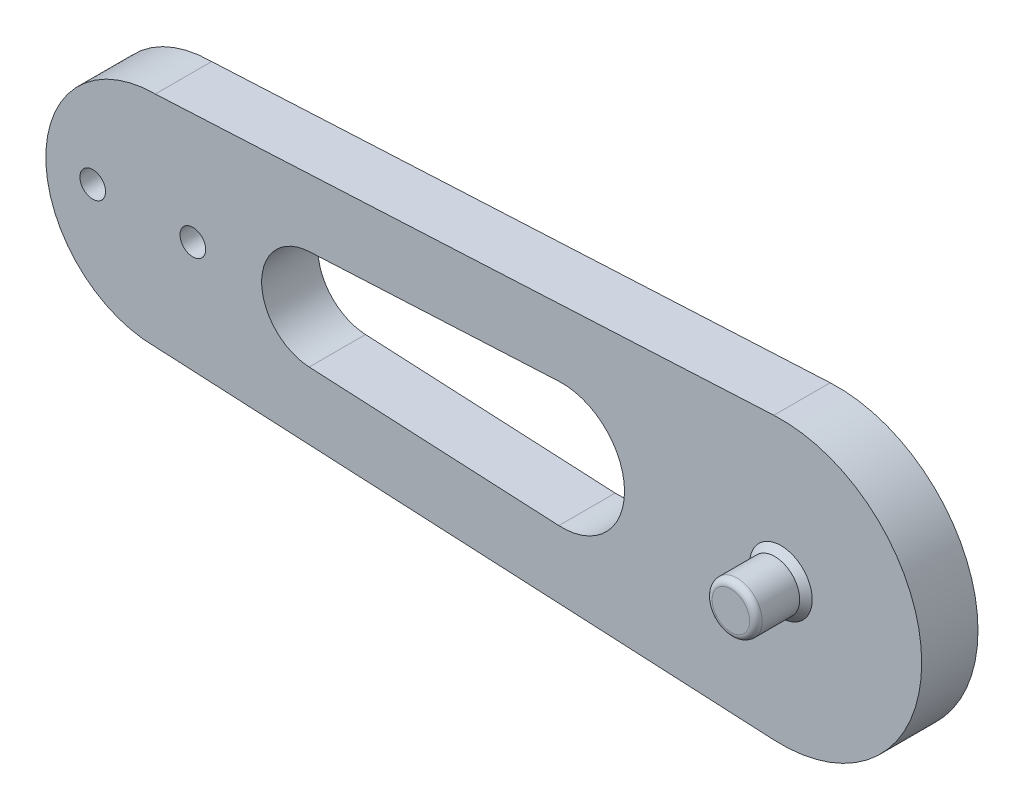
ISO-10303-21;
HEADER;
FILE_DESCRIPTION(('STEP AP214'),'2;1');
FILE_NAME('part.step','',(''),(''),'','','');
FILE_SCHEMA(('AUTOMOTIVE_DESIGN { 1 0 10303 214 1 1 1 1 }'));
ENDSEC;
DATA;
#1=APPLICATION_CONTEXT('core data for automotive mechanical design processes');
#2=APPLICATION_PROTOCOL_DEFINITION('international standard','automotive_design',2000,#1);
#3=PRODUCT_CONTEXT('',#1,'mechanical');
#4=PRODUCT('Part','Part','',(#3));
#5=PRODUCT_RELATED_PRODUCT_CATEGORY('part','',(#4));
#6=PRODUCT_DEFINITION_FORMATION('','',#4);
#7=PRODUCT_DEFINITION_CONTEXT('part definition',#1,'design');
#8=PRODUCT_DEFINITION('design','',#6,#7);
#9=PRODUCT_DEFINITION_SHAPE('','',#8);
#10=(LENGTH_UNIT() NAMED_UNIT(*) SI_UNIT(.MILLI.,.METRE.));
#11=(NAMED_UNIT(*) PLANE_ANGLE_UNIT() SI_UNIT($,.RADIAN.));
#12=(NAMED_UNIT(*) SI_UNIT($,.STERADIAN.) SOLID_ANGLE_UNIT());
#13=UNCERTAINTY_MEASURE_WITH_UNIT(LENGTH_MEASURE(1.E-05),#10,'distance_accuracy_value','');
#14=(GEOMETRIC_REPRESENTATION_CONTEXT(3) GLOBAL_UNCERTAINTY_ASSIGNED_CONTEXT((#13)) GLOBAL_UNIT_ASSIGNED_CONTEXT((#10,
#11,#12)) REPRESENTATION_CONTEXT('',''));
#15=CARTESIAN_POINT('',(0.,0.,0.));
#16=DIRECTION('',(0.,0.,1.));
#17=DIRECTION('',(1.,0.,0.));
#18=AXIS2_PLACEMENT_3D('',#15,#16,#17);
#19=CARTESIAN_POINT('',(0.,0.,0.));
#20=DIRECTION('',(0.,0.,1.));
#21=DIRECTION('',(1.,0.,0.));
#22=AXIS2_PLACEMENT_3D('',#19,#20,#21);
#23=PLANE('',#22);
#24=CARTESIAN_POINT('',(0.,0.,0.));
#25=DIRECTION('',(0.,0.,1.));
#26=DIRECTION('',(1.,0.,0.));
#27=AXIS2_PLACEMENT_3D('',#24,#25,#26);
#28=CIRCLE('',#27,22.5);
#29=CARTESIAN_POINT('',(-1.12996858091853,-22.471608109037,0.));
#30=VERTEX_POINT('',#29);
#31=CARTESIAN_POINT('',(-1.12996858091853,22.471608109037,0.));
#32=VERTEX_POINT('',#31);
#33=EDGE_CURVE('E249',#30,#32,#28,.T.);
#34=ORIENTED_EDGE('',*,*,#33,.F.);
#35=DIRECTION('',(0.998738138179422,-0.0502208258186011,0.));
#36=VECTOR('',#35,1.);
#37=CARTESIAN_POINT('',(-1.12996858091853,-22.471608109037,0.));
#38=LINE('',#37,#36);
#39=CARTESIAN_POINT('',(-100.,-17.5,0.));
#40=VERTEX_POINT('',#39);
#41=EDGE_CURVE('E254',#40,#30,#38,.T.);
#42=ORIENTED_EDGE('',*,*,#41,.F.);
#43=CARTESIAN_POINT('',(-100.,0.,0.));
#44=DIRECTION('',(0.,0.,1.));
#45=DIRECTION('',(1.,0.,0.));
#46=AXIS2_PLACEMENT_3D('',#43,#44,#45);
#47=CIRCLE('',#46,17.5);
#48=CARTESIAN_POINT('',(-100.,17.5,0.));
#49=VERTEX_POINT('',#48);
#50=EDGE_CURVE('E265',#49,#40,#47,.T.);
#51=ORIENTED_EDGE('',*,*,#50,.F.);
#52=DIRECTION('',(-0.998738138179422,-0.0502208258186011,0.));
#53=VECTOR('',#52,1.);
#54=CARTESIAN_POINT('',(-1.12996858091853,22.471608109037,0.));
#55=LINE('',#54,#53);
#56=EDGE_CURVE('E263',#32,#49,#55,.T.);
#57=ORIENTED_EDGE('',*,*,#56,.F.);
#58=EDGE_LOOP('',(#34,#42,#51,#57));
#59=FACE_BOUND('',#58,.T.);
#60=CARTESIAN_POINT('',(18.5,0.,0.));
#61=DIRECTION('',(0.,0.,1.));
#62=DIRECTION('',(1.,0.,0.));
#63=AXIS2_PLACEMENT_3D('',#60,#61,#62);
#64=CIRCLE('',#63,3.7);
#65=CARTESIAN_POINT('',(18.9806303864662,-3.66865021930483,0.));
#66=VERTEX_POINT('',#65);
#67=CARTESIAN_POINT('',(18.9806303864662,3.66865021930483,0.));
#68=VERTEX_POINT('',#67);
#69=EDGE_CURVE('E296',#66,#68,#64,.T.);
#70=ORIENTED_EDGE('',*,*,#69,.T.);
#71=DIRECTION('',(0.991527086298603,-0.129900104450315,0.));
#72=VECTOR('',#71,1.);
#73=CARTESIAN_POINT('',(0.792800073485915,6.05144045270167,0.));
#74=LINE('',#73,#72);
#75=CARTESIAN_POINT('',(4.19180590280305,5.60613621607837,0.));
#76=VERTEX_POINT('',#75);
#77=EDGE_CURVE('E308',#68,#76,#74,.F.);
#78=ORIENTED_EDGE('',*,*,#77,.T.);
#79=CARTESIAN_POINT('',(0.,0.,0.));
#80=DIRECTION('',(0.,0.,1.));
#81=DIRECTION('',(1.,0.,0.));
#82=AXIS2_PLACEMENT_3D('',#79,#80,#81);
#83=CIRCLE('',#82,7.);
#84=CARTESIAN_POINT('',(-4.19180590280305,5.60613621607837,0.));
#85=VERTEX_POINT('',#84);
#86=EDGE_CURVE('E306',#76,#85,#83,.T.);
#87=ORIENTED_EDGE('',*,*,#86,.T.);
#88=DIRECTION('',(0.991527086298603,0.129900104450315,0.));
#89=VECTOR('',#88,1.);
#90=CARTESIAN_POINT('',(-0.792800073485915,6.05144045270167,0.));
#91=LINE('',#90,#89);
#92=CARTESIAN_POINT('',(-18.9806303864662,3.66865021930483,0.));
#93=VERTEX_POINT('',#92);
#94=EDGE_CURVE('E304',#85,#93,#91,.F.);
#95=ORIENTED_EDGE('',*,*,#94,.T.);
#96=CARTESIAN_POINT('',(-18.5,0.,0.));
#97=DIRECTION('',(0.,0.,1.));
#98=DIRECTION('',(1.,0.,0.));
#99=AXIS2_PLACEMENT_3D('',#96,#97,#98);
#100=CIRCLE('',#99,3.7);
#101=CARTESIAN_POINT('',(-18.9806303864662,-3.66865021930483,0.));
#102=VERTEX_POINT('',#101);
#103=EDGE_CURVE('E302',#93,#102,#100,.T.);
#104=ORIENTED_EDGE('',*,*,#103,.T.);
#105=DIRECTION('',(-0.991527086298603,0.129900104450315,0.));
#106=VECTOR('',#105,1.);
#107=CARTESIAN_POINT('',(-0.792800073485916,-6.05144045270167,0.));
#108=LINE('',#107,#106);
#109=CARTESIAN_POINT('',(-4.19180590280305,-5.60613621607837,0.));
#110=VERTEX_POINT('',#109);
#111=EDGE_CURVE('E300',#102,#110,#108,.F.);
#112=ORIENTED_EDGE('',*,*,#111,.T.);
#113=CARTESIAN_POINT('',(0.,0.,0.));
#114=DIRECTION('',(0.,0.,1.));
#115=DIRECTION('',(1.,0.,0.));
#116=AXIS2_PLACEMENT_3D('',#113,#114,#115);
#117=CIRCLE('',#116,7.);
#118=CARTESIAN_POINT('',(4.19180590280305,-5.60613621607837,0.));
#119=VERTEX_POINT('',#118);
#120=EDGE_CURVE('E298',#110,#119,#117,.T.);
#121=ORIENTED_EDGE('',*,*,#120,.T.);
#122=DIRECTION('',(-0.991527086298603,-0.129900104450315,0.));
#123=VECTOR('',#122,1.);
#124=CARTESIAN_POINT('',(0.792800073485916,-6.05144045270167,0.));
#125=LINE('',#124,#123);
#126=EDGE_CURVE('E294',#119,#66,#125,.F.);
#127=ORIENTED_EDGE('',*,*,#126,.T.);
#128=EDGE_LOOP('',(#70,#78,#87,#95,#104,#112,#121,#127));
#129=FACE_BOUND('',#128,.T.);
#130=CARTESIAN_POINT('',(-75.,0.,0.));
#131=DIRECTION('',(0.,0.,1.));
#132=DIRECTION('',(1.,0.,0.));
#133=AXIS2_PLACEMENT_3D('',#130,#131,#132);
#134=CIRCLE('',#133,8.);
#135=CARTESIAN_POINT('',(-75.4,7.98999374217528,0.));
#136=VERTEX_POINT('',#135);
#137=CARTESIAN_POINT('',(-75.4,-7.98999374217528,0.));
#138=VERTEX_POINT('',#137);
#139=EDGE_CURVE('E57',#136,#138,#134,.T.);
#140=ORIENTED_EDGE('',*,*,#139,.T.);
#141=DIRECTION('',(0.998749217771909,-0.05,0.));
#142=VECTOR('',#141,1.);
#143=CARTESIAN_POINT('',(-75.4,-7.98999374217528,0.));
#144=LINE('',#143,#142);
#145=CARTESIAN_POINT('',(-35.5,-9.98749217771909,0.));
#146=VERTEX_POINT('',#145);
#147=EDGE_CURVE('E197',#138,#146,#144,.T.);
#148=ORIENTED_EDGE('',*,*,#147,.T.);
#149=CARTESIAN_POINT('',(-35.,0.,0.));
#150=DIRECTION('',(0.,0.,1.));
#151=DIRECTION('',(1.,0.,0.));
#152=AXIS2_PLACEMENT_3D('',#149,#150,#151);
#153=CIRCLE('',#152,10.);
#154=CARTESIAN_POINT('',(-35.5,9.98749217771909,0.));
#155=VERTEX_POINT('',#154);
#156=EDGE_CURVE('E182',#146,#155,#153,.T.);
#157=ORIENTED_EDGE('',*,*,#156,.T.);
#158=DIRECTION('',(-0.998749217771909,-0.05,0.));
#159=VECTOR('',#158,1.);
#160=CARTESIAN_POINT('',(-75.4,7.98999374217528,0.));
#161=LINE('',#160,#159);
#162=EDGE_CURVE('E191',#155,#136,#161,.T.);
#163=ORIENTED_EDGE('',*,*,#162,.T.);
#164=EDGE_LOOP('',(#140,#148,#157,#163));
#165=FACE_BOUND('',#164,.T.);
#166=CARTESIAN_POINT('',(-94.,0.,0.));
#167=DIRECTION('',(0.,0.,1.));
#168=DIRECTION('',(1.,0.,0.));
#169=AXIS2_PLACEMENT_3D('',#166,#167,#168);
#170=CIRCLE('',#169,2.05);
#171=CARTESIAN_POINT('',(-91.95,0.,0.));
#172=VERTEX_POINT('',#171);
#173=EDGE_CURVE('E203',#172,#172,#170,.T.);
#174=ORIENTED_EDGE('',*,*,#173,.T.);
#175=EDGE_LOOP('',(#174));
#176=FACE_BOUND('',#175,.T.);
#177=CARTESIAN_POINT('',(-110.,0.,0.));
#178=DIRECTION('',(0.,0.,1.));
#179=DIRECTION('',(1.,0.,0.));
#180=AXIS2_PLACEMENT_3D('',#177,#178,#179);
#181=CIRCLE('',#180,2.05);
#182=CARTESIAN_POINT('',(-107.95,0.,0.));
#183=VERTEX_POINT('',#182);
#184=EDGE_CURVE('E513',#183,#183,#181,.T.);
#185=ORIENTED_EDGE('',*,*,#184,.T.);
#186=EDGE_LOOP('',(#185));
#187=FACE_BOUND('',#186,.T.);
#188=ADVANCED_FACE('F40',(#59,#129,#165,#176,#187),#23,.F.);
#189=CARTESIAN_POINT('',(0.,0.,9.));
#190=DIRECTION('',(0.,0.,1.));
#191=DIRECTION('',(1.,0.,0.));
#192=AXIS2_PLACEMENT_3D('',#189,#190,#191);
#193=PLANE('',#192);
#194=CARTESIAN_POINT('',(-94.,0.,9.));
#195=DIRECTION('',(0.,0.,1.));
#196=DIRECTION('',(1.,0.,0.));
#197=AXIS2_PLACEMENT_3D('',#194,#195,#196);
#198=CIRCLE('',#197,2.05);
#199=CARTESIAN_POINT('',(-91.95,0.,9.));
#200=VERTEX_POINT('',#199);
#201=EDGE_CURVE('E515',#200,#200,#198,.F.);
#202=ORIENTED_EDGE('',*,*,#201,.T.);
#203=EDGE_LOOP('',(#202));
#204=FACE_BOUND('',#203,.T.);
#205=CARTESIAN_POINT('',(0.,0.,9.));
#206=DIRECTION('',(0.,0.,1.));
#207=DIRECTION('',(1.,0.,0.));
#208=AXIS2_PLACEMENT_3D('',#205,#206,#207);
#209=CIRCLE('',#208,4.99999999999998);
#210=CARTESIAN_POINT('',(4.99999999999998,0.,9.));
#211=VERTEX_POINT('',#210);
#212=EDGE_CURVE('E288',#211,#211,#209,.F.);
#213=ORIENTED_EDGE('',*,*,#212,.T.);
#214=EDGE_LOOP('',(#213));
#215=FACE_BOUND('',#214,.T.);
#216=CARTESIAN_POINT('',(0.,0.,9.));
#217=DIRECTION('',(0.,0.,1.));
#218=DIRECTION('',(1.,0.,0.));
#219=AXIS2_PLACEMENT_3D('',#216,#217,#218);
#220=CIRCLE('',#219,22.5);
#221=CARTESIAN_POINT('',(-1.12996858091853,-22.471608109037,9.));
#222=VERTEX_POINT('',#221);
#223=CARTESIAN_POINT('',(-1.12996858091853,22.471608109037,9.));
#224=VERTEX_POINT('',#223);
#225=EDGE_CURVE('E250',#222,#224,#220,.T.);
#226=ORIENTED_EDGE('',*,*,#225,.T.);
#227=DIRECTION('',(-0.998738138179422,-0.0502208258186011,0.));
#228=VECTOR('',#227,1.);
#229=CARTESIAN_POINT('',(-1.12996858091853,22.471608109037,9.));
#230=LINE('',#229,#228);
#231=CARTESIAN_POINT('',(-100.,17.5,9.));
#232=VERTEX_POINT('',#231);
#233=EDGE_CURVE('E253',#224,#232,#230,.T.);
#234=ORIENTED_EDGE('',*,*,#233,.T.);
#235=CARTESIAN_POINT('',(-100.,0.,9.));
#236=DIRECTION('',(0.,0.,1.));
#237=DIRECTION('',(1.,0.,0.));
#238=AXIS2_PLACEMENT_3D('',#235,#236,#237);
#239=CIRCLE('',#238,17.5);
#240=CARTESIAN_POINT('',(-100.,-17.5,9.));
#241=VERTEX_POINT('',#240);
#242=EDGE_CURVE('E256',#232,#241,#239,.T.);
#243=ORIENTED_EDGE('',*,*,#242,.T.);
#244=DIRECTION('',(0.998738138179422,-0.0502208258186011,0.));
#245=VECTOR('',#244,1.);
#246=CARTESIAN_POINT('',(-1.12996858091853,-22.471608109037,9.));
#247=LINE('',#246,#245);
#248=EDGE_CURVE('E258',#241,#222,#247,.T.);
#249=ORIENTED_EDGE('',*,*,#248,.T.);
#250=EDGE_LOOP('',(#226,#234,#243,#249));
#251=FACE_BOUND('',#250,.T.);
#252=DIRECTION('',(-0.998749217771909,0.05,0.));
#253=VECTOR('',#252,1.);
#254=CARTESIAN_POINT('',(-0.5875,-11.7353033088199,9.));
#255=LINE('',#254,#253);
#256=CARTESIAN_POINT('',(-35.5,-9.98749217771909,9.));
#257=VERTEX_POINT('',#256);
#258=CARTESIAN_POINT('',(-75.4,-7.98999374217528,9.));
#259=VERTEX_POINT('',#258);
#260=EDGE_CURVE('E49',#257,#259,#255,.T.);
#261=ORIENTED_EDGE('',*,*,#260,.T.);
#262=CARTESIAN_POINT('',(-75.,0.,9.));
#263=DIRECTION('',(0.,0.,1.));
#264=DIRECTION('',(1.,0.,0.));
#265=AXIS2_PLACEMENT_3D('',#262,#263,#264);
#266=CIRCLE('',#265,8.);
#267=CARTESIAN_POINT('',(-75.4,7.98999374217528,9.));
#268=VERTEX_POINT('',#267);
#269=EDGE_CURVE('E11',#259,#268,#266,.F.);
#270=ORIENTED_EDGE('',*,*,#269,.T.);
#271=DIRECTION('',(0.998749217771909,0.05,0.));
#272=VECTOR('',#271,1.);
#273=CARTESIAN_POINT('',(-0.5875,11.7353033088199,9.));
#274=LINE('',#273,#272);
#275=CARTESIAN_POINT('',(-35.5,9.98749217771909,9.));
#276=VERTEX_POINT('',#275);
#277=EDGE_CURVE('E325',#268,#276,#274,.T.);
#278=ORIENTED_EDGE('',*,*,#277,.T.);
#279=CARTESIAN_POINT('',(-35.,0.,9.));
#280=DIRECTION('',(0.,0.,1.));
#281=DIRECTION('',(1.,0.,0.));
#282=AXIS2_PLACEMENT_3D('',#279,#280,#281);
#283=CIRCLE('',#282,10.);
#284=EDGE_CURVE('E185',#276,#257,#283,.F.);
#285=ORIENTED_EDGE('',*,*,#284,.T.);
#286=EDGE_LOOP('',(#261,#270,#278,#285));
#287=FACE_BOUND('',#286,.T.);
#288=CARTESIAN_POINT('',(-110.,0.,9.));
#289=DIRECTION('',(0.,0.,1.));
#290=DIRECTION('',(1.,0.,0.));
#291=AXIS2_PLACEMENT_3D('',#288,#289,#290);
#292=CIRCLE('',#291,2.05);
#293=CARTESIAN_POINT('',(-107.95,0.,9.));
#294=VERTEX_POINT('',#293);
#295=EDGE_CURVE('E44',#294,#294,#292,.F.);
#296=ORIENTED_EDGE('',*,*,#295,.T.);
#297=EDGE_LOOP('',(#296));
#298=FACE_BOUND('',#297,.T.);
#299=ADVANCED_FACE('F401',(#204,#215,#251,#287,#298),#193,.T.);
#300=CARTESIAN_POINT('',(0.,0.,9.));
#301=DIRECTION('',(0.,0.,-1.));
#302=DIRECTION('',(-1.,0.,0.));
#303=AXIS2_PLACEMENT_3D('',#300,#301,#302);
#304=CYLINDRICAL_SURFACE('',#303,22.5);
#305=ORIENTED_EDGE('',*,*,#33,.T.);
#306=DIRECTION('',(0.,0.,-1.));
#307=VECTOR('',#306,1.);
#308=CARTESIAN_POINT('',(-1.12996858091853,22.471608109037,9.));
#309=LINE('',#308,#307);
#310=EDGE_CURVE('E276',#224,#32,#309,.T.);
#311=ORIENTED_EDGE('',*,*,#310,.F.);
#312=ORIENTED_EDGE('',*,*,#225,.F.);
#313=DIRECTION('',(0.,0.,-1.));
#314=VECTOR('',#313,1.);
#315=CARTESIAN_POINT('',(-1.12996858091853,-22.471608109037,9.));
#316=LINE('',#315,#314);
#317=EDGE_CURVE('E260',#222,#30,#316,.T.);
#318=ORIENTED_EDGE('',*,*,#317,.T.);
#319=EDGE_LOOP('',(#305,#311,#312,#318));
#320=FACE_BOUND('',#319,.T.);
#321=ADVANCED_FACE('F408',(#320),#304,.T.);
#322=CARTESIAN_POINT('',(-1.12996858091853,22.471608109037,9.));
#323=DIRECTION('',(0.0502208258186011,-0.998738138179422,0.));
#324=DIRECTION('',(0.998738138179422,0.0502208258186011,0.));
#325=AXIS2_PLACEMENT_3D('',#322,#323,#324);
#326=PLANE('',#325);
#327=ORIENTED_EDGE('',*,*,#56,.T.);
#328=DIRECTION('',(0.,0.,-1.));
#329=VECTOR('',#328,1.);
#330=CARTESIAN_POINT('',(-100.,17.5,9.));
#331=LINE('',#330,#329);
#332=EDGE_CURVE('E273',#232,#49,#331,.T.);
#333=ORIENTED_EDGE('',*,*,#332,.F.);
#334=ORIENTED_EDGE('',*,*,#233,.F.);
#335=ORIENTED_EDGE('',*,*,#310,.T.);
#336=EDGE_LOOP('',(#327,#333,#334,#335));
#337=FACE_BOUND('',#336,.T.);
#338=ADVANCED_FACE('F423',(#337),#326,.F.);
#339=CARTESIAN_POINT('',(-100.,0.,9.));
#340=DIRECTION('',(0.,0.,-1.));
#341=DIRECTION('',(-1.,0.,0.));
#342=AXIS2_PLACEMENT_3D('',#339,#340,#341);
#343=CYLINDRICAL_SURFACE('',#342,17.5);
#344=ORIENTED_EDGE('',*,*,#50,.T.);
#345=DIRECTION('',(0.,0.,-1.));
#346=VECTOR('',#345,1.);
#347=CARTESIAN_POINT('',(-100.,-17.5,9.));
#348=LINE('',#347,#346);
#349=EDGE_CURVE('E270',#241,#40,#348,.T.);
#350=ORIENTED_EDGE('',*,*,#349,.F.);
#351=ORIENTED_EDGE('',*,*,#242,.F.);
#352=ORIENTED_EDGE('',*,*,#332,.T.);
#353=EDGE_LOOP('',(#344,#350,#351,#352));
#354=FACE_BOUND('',#353,.T.);
#355=ADVANCED_FACE('F419',(#354),#343,.T.);
#356=CARTESIAN_POINT('',(-1.12996858091853,-22.471608109037,9.));
#357=DIRECTION('',(0.0502208258186011,0.998738138179422,0.));
#358=DIRECTION('',(-0.998738138179422,0.0502208258186011,0.));
#359=AXIS2_PLACEMENT_3D('',#356,#357,#358);
#360=PLANE('',#359);
#361=ORIENTED_EDGE('',*,*,#41,.T.);
#362=ORIENTED_EDGE('',*,*,#317,.F.);
#363=ORIENTED_EDGE('',*,*,#248,.F.);
#364=ORIENTED_EDGE('',*,*,#349,.T.);
#365=EDGE_LOOP('',(#361,#362,#363,#364));
#366=FACE_BOUND('',#365,.T.);
#367=ADVANCED_FACE('F415',(#366),#360,.F.);
#368=CARTESIAN_POINT('',(0.,0.,17.));
#369=DIRECTION('',(0.,0.,-1.));
#370=DIRECTION('',(-1.,0.,0.));
#371=AXIS2_PLACEMENT_3D('',#368,#369,#370);
#372=CYLINDRICAL_SURFACE('',#371,4.);
#373=CARTESIAN_POINT('',(0.,0.,9.99999999999998));
#374=DIRECTION('',(0.,0.,1.));
#375=DIRECTION('',(1.,0.,0.));
#376=AXIS2_PLACEMENT_3D('',#373,#374,#375);
#377=CIRCLE('',#376,4.);
#378=CARTESIAN_POINT('',(4.,0.,9.99999999999998));
#379=VERTEX_POINT('',#378);
#380=EDGE_CURVE('E285',#379,#379,#377,.T.);
#381=ORIENTED_EDGE('',*,*,#380,.T.);
#382=EDGE_LOOP('',(#381));
#383=FACE_BOUND('',#382,.T.);
#384=CARTESIAN_POINT('',(0.,0.,16.));
#385=DIRECTION('',(0.,0.,1.));
#386=DIRECTION('',(1.,0.,0.));
#387=AXIS2_PLACEMENT_3D('',#384,#385,#386);
#388=CIRCLE('',#387,4.);
#389=CARTESIAN_POINT('',(4.,0.,16.));
#390=VERTEX_POINT('',#389);
#391=EDGE_CURVE('E282',#390,#390,#388,.F.);
#392=ORIENTED_EDGE('',*,*,#391,.T.);
#393=EDGE_LOOP('',(#392));
#394=FACE_BOUND('',#393,.T.);
#395=ADVANCED_FACE('F418',(#383,#394),#372,.T.);
#396=CARTESIAN_POINT('',(0.,0.,17.));
#397=DIRECTION('',(0.,0.,1.));
#398=DIRECTION('',(1.,0.,0.));
#399=AXIS2_PLACEMENT_3D('',#396,#397,#398);
#400=PLANE('',#399);
#401=CARTESIAN_POINT('',(0.,0.,17.));
#402=DIRECTION('',(0.,0.,1.));
#403=DIRECTION('',(1.,0.,0.));
#404=AXIS2_PLACEMENT_3D('',#401,#402,#403);
#405=CIRCLE('',#404,3.);
#406=CARTESIAN_POINT('',(3.,0.,17.));
#407=VERTEX_POINT('',#406);
#408=EDGE_CURVE('E279',#407,#407,#405,.T.);
#409=ORIENTED_EDGE('',*,*,#408,.T.);
#410=EDGE_LOOP('',(#409));
#411=FACE_BOUND('',#410,.T.);
#412=ADVANCED_FACE('F434',(#411),#400,.T.);
#413=CARTESIAN_POINT('',(0.,0.,16.));
#414=DIRECTION('',(0.,0.,1.));
#415=DIRECTION('',(1.,0.,0.));
#416=AXIS2_PLACEMENT_3D('',#413,#414,#415);
#417=TOROIDAL_SURFACE('',#416,3.,1.);
#418=ORIENTED_EDGE('',*,*,#391,.F.);
#419=EDGE_LOOP('',(#418));
#420=FACE_BOUND('',#419,.T.);
#421=ORIENTED_EDGE('',*,*,#408,.F.);
#422=EDGE_LOOP('',(#421));
#423=FACE_BOUND('',#422,.T.);
#424=ADVANCED_FACE('F431',(#420,#423),#417,.T.);
#425=CARTESIAN_POINT('',(0.,0.,9.99999999999998));
#426=DIRECTION('',(0.,0.,-1.));
#427=DIRECTION('',(-1.,0.,0.));
#428=AXIS2_PLACEMENT_3D('',#425,#426,#427);
#429=CONICAL_SURFACE('',#428,4.,0.785398163397448);
#430=ORIENTED_EDGE('',*,*,#212,.F.);
#431=EDGE_LOOP('',(#430));
#432=FACE_BOUND('',#431,.T.);
#433=ORIENTED_EDGE('',*,*,#380,.F.);
#434=EDGE_LOOP('',(#433));
#435=FACE_BOUND('',#434,.T.);
#436=ADVANCED_FACE('F433',(#432,#435),#429,.T.);
#437=CARTESIAN_POINT('',(-18.5,0.,6.));
#438=DIRECTION('',(0.,0.,-1.));
#439=DIRECTION('',(-1.,0.,0.));
#440=AXIS2_PLACEMENT_3D('',#437,#438,#439);
#441=CYLINDRICAL_SURFACE('',#440,2.7);
#442=DIRECTION('',(0.,0.,-1.));
#443=VECTOR('',#442,1.);
#444=CARTESIAN_POINT('',(-18.8507302820159,-2.67712313300623,6.));
#445=LINE('',#444,#443);
#446=CARTESIAN_POINT('',(-18.8507302820159,-2.67712313300623,6.));
#447=VERTEX_POINT('',#446);
#448=CARTESIAN_POINT('',(-18.8507302820159,-2.67712313300623,1.));
#449=VERTEX_POINT('',#448);
#450=EDGE_CURVE('E246',#447,#449,#445,.T.);
#451=ORIENTED_EDGE('',*,*,#450,.T.);
#452=CARTESIAN_POINT('',(-18.5,0.,1.));
#453=DIRECTION('',(0.,0.,1.));
#454=DIRECTION('',(1.,0.,0.));
#455=AXIS2_PLACEMENT_3D('',#452,#453,#454);
#456=CIRCLE('',#455,2.7);
#457=CARTESIAN_POINT('',(-18.8507302820159,2.67712313300623,1.));
#458=VERTEX_POINT('',#457);
#459=EDGE_CURVE('E315',#449,#458,#456,.F.);
#460=ORIENTED_EDGE('',*,*,#459,.T.);
#461=DIRECTION('',(0.,0.,-1.));
#462=VECTOR('',#461,1.);
#463=CARTESIAN_POINT('',(-18.8507302820159,2.67712313300623,6.));
#464=LINE('',#463,#462);
#465=CARTESIAN_POINT('',(-18.8507302820159,2.67712313300623,6.));
#466=VERTEX_POINT('',#465);
#467=EDGE_CURVE('E225',#466,#458,#464,.T.);
#468=ORIENTED_EDGE('',*,*,#467,.F.);
#469=CARTESIAN_POINT('',(-18.5,0.,6.));
#470=DIRECTION('',(0.,0.,1.));
#471=DIRECTION('',(1.,0.,0.));
#472=AXIS2_PLACEMENT_3D('',#469,#470,#471);
#473=CIRCLE('',#472,2.7);
#474=EDGE_CURVE('E204',#466,#447,#473,.T.);
#475=ORIENTED_EDGE('',*,*,#474,.T.);
#476=EDGE_LOOP('',(#451,#460,#468,#475));
#477=FACE_BOUND('',#476,.T.);
#478=ADVANCED_FACE('F440',(#477),#441,.F.);
#479=CARTESIAN_POINT('',(-0.662899969035601,-5.05991336640307,6.));
#480=DIRECTION('',(-0.129900104450315,-0.991527086298603,0.));
#481=DIRECTION('',(0.991527086298603,-0.129900104450315,0.));
#482=AXIS2_PLACEMENT_3D('',#479,#480,#481);
#483=PLANE('',#482);
#484=DIRECTION('',(0.,0.,-1.));
#485=VECTOR('',#484,1.);
#486=CARTESIAN_POINT('',(-3.79176739792936,-4.65,6.));
#487=LINE('',#486,#485);
#488=CARTESIAN_POINT('',(-3.79176739792936,-4.65,6.));
#489=VERTEX_POINT('',#488);
#490=CARTESIAN_POINT('',(-3.79176739792936,-4.65,1.));
#491=VERTEX_POINT('',#490);
#492=EDGE_CURVE('E243',#489,#491,#487,.T.);
#493=ORIENTED_EDGE('',*,*,#492,.T.);
#494=DIRECTION('',(-0.991527086298603,0.129900104450315,0.));
#495=VECTOR('',#494,1.);
#496=CARTESIAN_POINT('',(-0.662899969035601,-5.05991336640307,1.));
#497=LINE('',#496,#495);
#498=EDGE_CURVE('E317',#491,#449,#497,.T.);
#499=ORIENTED_EDGE('',*,*,#498,.T.);
#500=ORIENTED_EDGE('',*,*,#450,.F.);
#501=DIRECTION('',(-0.991527086298603,0.129900104450315,0.));
#502=VECTOR('',#501,1.);
#503=CARTESIAN_POINT('',(-0.662899969035601,-5.05991336640307,6.));
#504=LINE('',#503,#502);
#505=EDGE_CURVE('E206',#489,#447,#504,.T.);
#506=ORIENTED_EDGE('',*,*,#505,.F.);
#507=EDGE_LOOP('',(#493,#499,#500,#506));
#508=FACE_BOUND('',#507,.T.);
#509=ADVANCED_FACE('F446',(#508),#483,.F.);
#510=CARTESIAN_POINT('',(0.,0.,6.));
#511=DIRECTION('',(0.,0.,-1.));
#512=DIRECTION('',(-1.,0.,0.));
#513=AXIS2_PLACEMENT_3D('',#510,#511,#512);
#514=CYLINDRICAL_SURFACE('',#513,6.);
#515=DIRECTION('',(0.,0.,-1.));
#516=VECTOR('',#515,1.);
#517=CARTESIAN_POINT('',(3.79176739792936,-4.65,6.));
#518=LINE('',#517,#516);
#519=CARTESIAN_POINT('',(3.79176739792936,-4.65,6.));
#520=VERTEX_POINT('',#519);
#521=CARTESIAN_POINT('',(3.79176739792936,-4.65,1.));
#522=VERTEX_POINT('',#521);
#523=EDGE_CURVE('E240',#520,#522,#518,.T.);
#524=ORIENTED_EDGE('',*,*,#523,.T.);
#525=CARTESIAN_POINT('',(0.,0.,1.));
#526=DIRECTION('',(0.,0.,1.));
#527=DIRECTION('',(1.,0.,0.));
#528=AXIS2_PLACEMENT_3D('',#525,#526,#527);
#529=CIRCLE('',#528,6.);
#530=EDGE_CURVE('E319',#522,#491,#529,.F.);
#531=ORIENTED_EDGE('',*,*,#530,.T.);
#532=ORIENTED_EDGE('',*,*,#492,.F.);
#533=CARTESIAN_POINT('',(0.,0.,6.));
#534=DIRECTION('',(0.,0.,1.));
#535=DIRECTION('',(1.,0.,0.));
#536=AXIS2_PLACEMENT_3D('',#533,#534,#535);
#537=CIRCLE('',#536,6.);
#538=EDGE_CURVE('E210',#489,#520,#537,.T.);
#539=ORIENTED_EDGE('',*,*,#538,.T.);
#540=EDGE_LOOP('',(#524,#531,#532,#539));
#541=FACE_BOUND('',#540,.T.);
#542=ADVANCED_FACE('F465',(#541),#514,.F.);
#543=CARTESIAN_POINT('',(0.662899969035601,-5.05991336640307,6.));
#544=DIRECTION('',(0.129900104450315,-0.991527086298603,0.));
#545=DIRECTION('',(0.991527086298603,0.129900104450315,0.));
#546=AXIS2_PLACEMENT_3D('',#543,#544,#545);
#547=PLANE('',#546);
#548=DIRECTION('',(0.,0.,-1.));
#549=VECTOR('',#548,1.);
#550=CARTESIAN_POINT('',(18.8507302820159,-2.67712313300623,6.));
#551=LINE('',#550,#549);
#552=CARTESIAN_POINT('',(18.8507302820159,-2.67712313300623,6.));
#553=VERTEX_POINT('',#552);
#554=CARTESIAN_POINT('',(18.8507302820159,-2.67712313300623,1.));
#555=VERTEX_POINT('',#554);
#556=EDGE_CURVE('E237',#553,#555,#551,.T.);
#557=ORIENTED_EDGE('',*,*,#556,.T.);
#558=DIRECTION('',(-0.991527086298603,-0.129900104450315,0.));
#559=VECTOR('',#558,1.);
#560=CARTESIAN_POINT('',(0.662899969035601,-5.05991336640307,1.));
#561=LINE('',#560,#559);
#562=EDGE_CURVE('E323',#555,#522,#561,.T.);
#563=ORIENTED_EDGE('',*,*,#562,.T.);
#564=ORIENTED_EDGE('',*,*,#523,.F.);
#565=DIRECTION('',(-0.991527086298603,-0.129900104450315,0.));
#566=VECTOR('',#565,1.);
#567=CARTESIAN_POINT('',(0.662899969035601,-5.05991336640307,6.));
#568=LINE('',#567,#566);
#569=EDGE_CURVE('E212',#553,#520,#568,.T.);
#570=ORIENTED_EDGE('',*,*,#569,.F.);
#571=EDGE_LOOP('',(#557,#563,#564,#570));
#572=FACE_BOUND('',#571,.T.);
#573=ADVANCED_FACE('F469',(#572),#547,.F.);
#574=CARTESIAN_POINT('',(18.5,0.,6.));
#575=DIRECTION('',(0.,0.,-1.));
#576=DIRECTION('',(-1.,0.,0.));
#577=AXIS2_PLACEMENT_3D('',#574,#575,#576);
#578=CYLINDRICAL_SURFACE('',#577,2.7);
#579=DIRECTION('',(0.,0.,-1.));
#580=VECTOR('',#579,1.);
#581=CARTESIAN_POINT('',(18.8507302820159,2.67712313300623,6.));
#582=LINE('',#581,#580);
#583=CARTESIAN_POINT('',(18.8507302820159,2.67712313300623,6.));
#584=VERTEX_POINT('',#583);
#585=CARTESIAN_POINT('',(18.8507302820159,2.67712313300623,1.));
#586=VERTEX_POINT('',#585);
#587=EDGE_CURVE('E234',#584,#586,#582,.T.);
#588=ORIENTED_EDGE('',*,*,#587,.T.);
#589=CARTESIAN_POINT('',(18.5,0.,1.));
#590=DIRECTION('',(0.,0.,1.));
#591=DIRECTION('',(1.,0.,0.));
#592=AXIS2_PLACEMENT_3D('',#589,#590,#591);
#593=CIRCLE('',#592,2.7);
#594=EDGE_CURVE('E321',#586,#555,#593,.F.);
#595=ORIENTED_EDGE('',*,*,#594,.T.);
#596=ORIENTED_EDGE('',*,*,#556,.F.);
#597=CARTESIAN_POINT('',(18.5,0.,6.));
#598=DIRECTION('',(0.,0.,1.));
#599=DIRECTION('',(1.,0.,0.));
#600=AXIS2_PLACEMENT_3D('',#597,#598,#599);
#601=CIRCLE('',#600,2.7);
#602=EDGE_CURVE('E215',#553,#584,#601,.T.);
#603=ORIENTED_EDGE('',*,*,#602,.T.);
#604=EDGE_LOOP('',(#588,#595,#596,#603));
#605=FACE_BOUND('',#604,.T.);
#606=ADVANCED_FACE('F473',(#605),#578,.F.);
#607=CARTESIAN_POINT('',(0.6628999690356,5.05991336640307,6.));
#608=DIRECTION('',(0.129900104450315,0.991527086298603,0.));
#609=DIRECTION('',(-0.991527086298603,0.129900104450315,0.));
#610=AXIS2_PLACEMENT_3D('',#607,#608,#609);
#611=PLANE('',#610);
#612=DIRECTION('',(0.,0.,-1.));
#613=VECTOR('',#612,1.);
#614=CARTESIAN_POINT('',(3.79176739792936,4.65,6.));
#615=LINE('',#614,#613);
#616=CARTESIAN_POINT('',(3.79176739792936,4.65,6.));
#617=VERTEX_POINT('',#616);
#618=CARTESIAN_POINT('',(3.79176739792936,4.65,1.));
#619=VERTEX_POINT('',#618);
#620=EDGE_CURVE('E231',#617,#619,#615,.T.);
#621=ORIENTED_EDGE('',*,*,#620,.T.);
#622=DIRECTION('',(0.991527086298603,-0.129900104450315,0.));
#623=VECTOR('',#622,1.);
#624=CARTESIAN_POINT('',(0.6628999690356,5.05991336640307,1.));
#625=LINE('',#624,#623);
#626=EDGE_CURVE('E291',#619,#586,#625,.T.);
#627=ORIENTED_EDGE('',*,*,#626,.T.);
#628=ORIENTED_EDGE('',*,*,#587,.F.);
#629=DIRECTION('',(0.991527086298603,-0.129900104450315,0.));
#630=VECTOR('',#629,1.);
#631=CARTESIAN_POINT('',(0.6628999690356,5.05991336640307,6.));
#632=LINE('',#631,#630);
#633=EDGE_CURVE('E217',#617,#584,#632,.T.);
#634=ORIENTED_EDGE('',*,*,#633,.F.);
#635=EDGE_LOOP('',(#621,#627,#628,#634));
#636=FACE_BOUND('',#635,.T.);
#637=ADVANCED_FACE('F477',(#636),#611,.F.);
#638=CARTESIAN_POINT('',(0.,0.,6.));
#639=DIRECTION('',(0.,0.,-1.));
#640=DIRECTION('',(-1.,0.,0.));
#641=AXIS2_PLACEMENT_3D('',#638,#639,#640);
#642=CYLINDRICAL_SURFACE('',#641,6.);
#643=DIRECTION('',(0.,0.,-1.));
#644=VECTOR('',#643,1.);
#645=CARTESIAN_POINT('',(-3.79176739792936,4.65,6.));
#646=LINE('',#645,#644);
#647=CARTESIAN_POINT('',(-3.79176739792936,4.65,6.));
#648=VERTEX_POINT('',#647);
#649=CARTESIAN_POINT('',(-3.79176739792936,4.65,1.));
#650=VERTEX_POINT('',#649);
#651=EDGE_CURVE('E228',#648,#650,#646,.T.);
#652=ORIENTED_EDGE('',*,*,#651,.T.);
#653=CARTESIAN_POINT('',(0.,0.,1.));
#654=DIRECTION('',(0.,0.,1.));
#655=DIRECTION('',(1.,0.,0.));
#656=AXIS2_PLACEMENT_3D('',#653,#654,#655);
#657=CIRCLE('',#656,6.);
#658=EDGE_CURVE('E311',#650,#619,#657,.F.);
#659=ORIENTED_EDGE('',*,*,#658,.T.);
#660=ORIENTED_EDGE('',*,*,#620,.F.);
#661=CARTESIAN_POINT('',(0.,0.,6.));
#662=DIRECTION('',(0.,0.,1.));
#663=DIRECTION('',(1.,0.,0.));
#664=AXIS2_PLACEMENT_3D('',#661,#662,#663);
#665=CIRCLE('',#664,6.);
#666=EDGE_CURVE('E220',#617,#648,#665,.T.);
#667=ORIENTED_EDGE('',*,*,#666,.T.);
#668=EDGE_LOOP('',(#652,#659,#660,#667));
#669=FACE_BOUND('',#668,.T.);
#670=ADVANCED_FACE('F481',(#669),#642,.F.);
#671=CARTESIAN_POINT('',(-0.6628999690356,5.05991336640307,6.));
#672=DIRECTION('',(-0.129900104450315,0.991527086298603,0.));
#673=DIRECTION('',(-0.991527086298603,-0.129900104450315,0.));
#674=AXIS2_PLACEMENT_3D('',#671,#672,#673);
#675=PLANE('',#674);
#676=ORIENTED_EDGE('',*,*,#467,.T.);
#677=DIRECTION('',(0.991527086298603,0.129900104450315,0.));
#678=VECTOR('',#677,1.);
#679=CARTESIAN_POINT('',(-0.6628999690356,5.05991336640307,1.));
#680=LINE('',#679,#678);
#681=EDGE_CURVE('E313',#458,#650,#680,.T.);
#682=ORIENTED_EDGE('',*,*,#681,.T.);
#683=ORIENTED_EDGE('',*,*,#651,.F.);
#684=DIRECTION('',(0.991527086298603,0.129900104450315,0.));
#685=VECTOR('',#684,1.);
#686=CARTESIAN_POINT('',(-0.6628999690356,5.05991336640307,6.));
#687=LINE('',#686,#685);
#688=EDGE_CURVE('E222',#466,#648,#687,.T.);
#689=ORIENTED_EDGE('',*,*,#688,.F.);
#690=EDGE_LOOP('',(#676,#682,#683,#689));
#691=FACE_BOUND('',#690,.T.);
#692=ADVANCED_FACE('F396',(#691),#675,.F.);
#693=CARTESIAN_POINT('',(-18.5,0.,6.));
#694=DIRECTION('',(0.,0.,1.));
#695=DIRECTION('',(1.,0.,0.));
#696=AXIS2_PLACEMENT_3D('',#693,#694,#695);
#697=PLANE('',#696);
#698=ORIENTED_EDGE('',*,*,#474,.F.);
#699=ORIENTED_EDGE('',*,*,#688,.T.);
#700=ORIENTED_EDGE('',*,*,#666,.F.);
#701=ORIENTED_EDGE('',*,*,#633,.T.);
#702=ORIENTED_EDGE('',*,*,#602,.F.);
#703=ORIENTED_EDGE('',*,*,#569,.T.);
#704=ORIENTED_EDGE('',*,*,#538,.F.);
#705=ORIENTED_EDGE('',*,*,#505,.T.);
#706=EDGE_LOOP('',(#698,#699,#700,#701,#702,#703,#704,#705));
#707=FACE_BOUND('',#706,.T.);
#708=ADVANCED_FACE('F388',(#707),#697,.F.);
#709=CARTESIAN_POINT('',(-0.792800073485916,-6.05144045270167,1.));
#710=DIRECTION('',(-0.991527086298603,0.129900104450315,0.));
#711=DIRECTION('',(-0.129900104450315,-0.991527086298603,0.));
#712=AXIS2_PLACEMENT_3D('',#709,#710,#711);
#713=CYLINDRICAL_SURFACE('',#712,1.);
#714=CARTESIAN_POINT('',(-3.79176739792936,-4.65,1.));
#715=CARTESIAN_POINT('',(-3.79176708813101,-4.6499996676934,0.972622754955856));
#716=CARTESIAN_POINT('',(-3.79223058404637,-4.65107394986767,0.945258931531774));
#717=CARTESIAN_POINT('',(-3.79407711853955,-4.65535629109024,0.890733560895947));
#718=CARTESIAN_POINT('',(-3.79546003709375,-4.65856407162665,0.863571987749903));
#719=CARTESIAN_POINT('',(-3.80096614549942,-4.671342020442,0.782787703515554));
#720=CARTESIAN_POINT('',(-3.8064467854487,-4.68406698887002,0.729716732284436));
#721=CARTESIAN_POINT('',(-3.82081648683569,-4.71750127368767,0.626673402275323));
#722=CARTESIAN_POINT('',(-3.82970579959958,-4.7382111788184,0.576701272294893));
#723=CARTESIAN_POINT('',(-3.85056323883839,-4.78694167407619,0.481153854578301));
#724=CARTESIAN_POINT('',(-3.86253167323227,-4.81496299536501,0.435579007207248));
#725=CARTESIAN_POINT('',(-3.88936030206239,-4.87799088905477,0.349246242999885));
#726=CARTESIAN_POINT('',(-3.90426636199223,-4.91310851180997,0.308583806791671));
#727=CARTESIAN_POINT('',(-3.9363482148135,-4.98898962886102,0.233962240404477));
#728=CARTESIAN_POINT('',(-3.95352479571003,-5.02975508352593,0.200005447731116));
#729=CARTESIAN_POINT('',(-3.99026932999844,-5.11733403408714,0.138492786441111));
#730=CARTESIAN_POINT('',(-4.00990071173176,-5.16431134911651,0.111208312707452));
#731=CARTESIAN_POINT('',(-4.05045154481212,-5.26179790802195,0.0652927486474735));
#732=CARTESIAN_POINT('',(-4.07137064463503,-5.31230618851359,0.0466593085032904));
#733=CARTESIAN_POINT('',(-4.10837775129718,-5.40207514621668,0.0221117232918916));
#734=CARTESIAN_POINT('',(-4.1243121359302,-5.44085682974731,0.0141524148575673));
#735=CARTESIAN_POINT('',(-4.15631594220972,-5.51901419177225,0.00330029971859399));
#736=CARTESIAN_POINT('',(-4.1723850614846,-5.55838864618364,0.000398198740118216));
#737=CARTESIAN_POINT('',(-4.18953650777609,-5.60055499720777,1.27099500734019E-05));
#738=CARTESIAN_POINT('',(-4.19067136185869,-5.60334566236475,-3.36051090950743E-08));
#739=CARTESIAN_POINT('',(-4.19180590280305,-5.60613621607837,0.));
#740=B_SPLINE_CURVE_WITH_KNOTS('',3,(#714,#715,#716,#717,#718,#719,#720,#721,#722,#723,#724,
#725,#726,#727,#728,#729,#730,#731,#732,#733,#734,#735,#736,#737,#738,#739),.UNSPECIFIED.,.F.,
.F.,(4,2,2,2,2,2,2,2,2,2,2,2,4),(0.,0.0820802519749878,0.164149791103212,0.327848573814883,
0.491559428586703,0.655286661174151,0.821808095913618,0.988387475925257,1.16090626973965,
1.33337817606331,1.46113391394009,1.58865461023116,1.59769233762937),.UNSPECIFIED.);
#741=EDGE_CURVE('E376',#110,#491,#740,.F.);
#742=ORIENTED_EDGE('',*,*,#741,.F.);
#743=ORIENTED_EDGE('',*,*,#111,.F.);
#744=CARTESIAN_POINT('',(-18.9806303864662,-3.66865021930483,1.));
#745=DIRECTION('',(-0.991527086298603,0.129900104450315,0.));
#746=DIRECTION('',(-0.129900104450315,-0.991527086298603,0.));
#747=AXIS2_PLACEMENT_3D('',#744,#745,#746);
#748=CIRCLE('',#747,1.);
#749=EDGE_CURVE('E207',#449,#102,#748,.T.);
#750=ORIENTED_EDGE('',*,*,#749,.F.);
#751=ORIENTED_EDGE('',*,*,#498,.F.);
#752=EDGE_LOOP('',(#742,#743,#750,#751));
#753=FACE_BOUND('',#752,.T.);
#754=ADVANCED_FACE('F385',(#753),#713,.T.);
#755=CARTESIAN_POINT('',(-18.5,0.,1.));
#756=DIRECTION('',(0.,0.,1.));
#757=DIRECTION('',(1.,0.,0.));
#758=AXIS2_PLACEMENT_3D('',#755,#756,#757);
#759=TOROIDAL_SURFACE('',#758,3.7,1.);
#760=ORIENTED_EDGE('',*,*,#749,.T.);
#761=ORIENTED_EDGE('',*,*,#103,.F.);
#762=CARTESIAN_POINT('',(-18.9806303864662,3.66865021930483,1.));
#763=DIRECTION('',(0.991527086298603,0.129900104450315,0.));
#764=DIRECTION('',(-0.129900104450315,0.991527086298603,0.));
#765=AXIS2_PLACEMENT_3D('',#762,#763,#764);
#766=CIRCLE('',#765,1.);
#767=EDGE_CURVE('E383',#458,#93,#766,.T.);
#768=ORIENTED_EDGE('',*,*,#767,.F.);
#769=ORIENTED_EDGE('',*,*,#459,.F.);
#770=EDGE_LOOP('',(#760,#761,#768,#769));
#771=FACE_BOUND('',#770,.T.);
#772=ADVANCED_FACE('F42',(#771),#759,.T.);
#773=CARTESIAN_POINT('',(0.,0.,1.));
#774=DIRECTION('',(0.,0.,1.));
#775=DIRECTION('',(1.,0.,0.));
#776=AXIS2_PLACEMENT_3D('',#773,#774,#775);
#777=TOROIDAL_SURFACE('',#776,7.,1.);
#778=ORIENTED_EDGE('',*,*,#741,.T.);
#779=ORIENTED_EDGE('',*,*,#530,.F.);
#780=CARTESIAN_POINT('',(3.79176739792936,-4.65,1.));
#781=CARTESIAN_POINT('',(3.79176708813101,-4.6499996676934,0.972622754955856));
#782=CARTESIAN_POINT('',(3.79223058404637,-4.65107394986767,0.945258931531774));
#783=CARTESIAN_POINT('',(3.79407711853955,-4.65535629109024,0.890733560895947));
#784=CARTESIAN_POINT('',(3.79546003709375,-4.65856407162665,0.863571987749903));
#785=CARTESIAN_POINT('',(3.80096614549942,-4.671342020442,0.782787703515554));
#786=CARTESIAN_POINT('',(3.8064467854487,-4.68406698887002,0.729716732284436));
#787=CARTESIAN_POINT('',(3.82081648683569,-4.71750127368767,0.626673402275323));
#788=CARTESIAN_POINT('',(3.82970579959958,-4.7382111788184,0.576701272294894));
#789=CARTESIAN_POINT('',(3.85056323883839,-4.78694167407618,0.481153854578301));
#790=CARTESIAN_POINT('',(3.86253167323227,-4.81496299536501,0.435579007207248));
#791=CARTESIAN_POINT('',(3.88936030206239,-4.87799088905477,0.349246242999885));
#792=CARTESIAN_POINT('',(3.90426636199222,-4.91310851180997,0.30858380679167));
#793=CARTESIAN_POINT('',(3.9363482148135,-4.98898962886102,0.233962240404477));
#794=CARTESIAN_POINT('',(3.95352479571003,-5.02975508352593,0.200005447731116));
#795=CARTESIAN_POINT('',(3.99026932999844,-5.11733403408714,0.138492786441111));
#796=CARTESIAN_POINT('',(4.00990071173176,-5.16431134911651,0.111208312707452));
#797=CARTESIAN_POINT('',(4.05045154481212,-5.26179790802195,0.0652927486474734));
#798=CARTESIAN_POINT('',(4.07137064463503,-5.31230618851359,0.0466593085032903));
#799=CARTESIAN_POINT('',(4.10837775129718,-5.40207514621668,0.0221117232918915));
#800=CARTESIAN_POINT('',(4.12431213593019,-5.44085682974731,0.0141524148575671));
#801=CARTESIAN_POINT('',(4.15631594220972,-5.51901419177225,0.00330029971859378));
#802=CARTESIAN_POINT('',(4.1723850614846,-5.55838864618364,0.00039819874011798));
#803=CARTESIAN_POINT('',(4.18953650777609,-5.60055499720777,1.27099500733704E-05));
#804=CARTESIAN_POINT('',(4.19067136185869,-5.60334566236475,-3.36051091119875E-08));
#805=CARTESIAN_POINT('',(4.19180590280305,-5.60613621607837,0.));
#806=B_SPLINE_CURVE_WITH_KNOTS('',3,(#780,#781,#782,#783,#784,#785,#786,#787,#788,#789,#790,
#791,#792,#793,#794,#795,#796,#797,#798,#799,#800,#801,#802,#803,#804,#805),.UNSPECIFIED.,.F.,
.F.,(4,2,2,2,2,2,2,2,2,2,2,2,4),(0.,0.0820802519749878,0.164149791103212,0.327848573814883,
0.491559428586702,0.655286661174151,0.821808095913619,0.988387475925257,1.16090626973965,
1.33337817606331,1.46113391394009,1.58865461023116,1.59769233762937),.UNSPECIFIED.);
#807=EDGE_CURVE('E357',#119,#522,#806,.F.);
#808=ORIENTED_EDGE('',*,*,#807,.F.);
#809=ORIENTED_EDGE('',*,*,#120,.F.);
#810=EDGE_LOOP('',(#778,#779,#808,#809));
#811=FACE_BOUND('',#810,.T.);
#812=ADVANCED_FACE('F368',(#811),#777,.T.);
#813=CARTESIAN_POINT('',(-0.792800073485915,6.05144045270167,1.));
#814=DIRECTION('',(0.991527086298603,0.129900104450315,0.));
#815=DIRECTION('',(-0.129900104450315,0.991527086298603,0.));
#816=AXIS2_PLACEMENT_3D('',#813,#814,#815);
#817=CYLINDRICAL_SURFACE('',#816,1.);
#818=ORIENTED_EDGE('',*,*,#767,.T.);
#819=ORIENTED_EDGE('',*,*,#94,.F.);
#820=CARTESIAN_POINT('',(-3.79176739792936,4.65,1.));
#821=CARTESIAN_POINT('',(-3.79176708813101,4.6499996676934,0.972622754955856));
#822=CARTESIAN_POINT('',(-3.79223058404637,4.65107394986767,0.945258931531774));
#823=CARTESIAN_POINT('',(-3.79407711853955,4.65535629109024,0.890733560895947));
#824=CARTESIAN_POINT('',(-3.79546003709375,4.65856407162665,0.863571987749903));
#825=CARTESIAN_POINT('',(-3.80096614549942,4.671342020442,0.782787703515554));
#826=CARTESIAN_POINT('',(-3.80644678544869,4.68406698887002,0.729716732284436));
#827=CARTESIAN_POINT('',(-3.82081648683568,4.71750127368767,0.626673402275323));
#828=CARTESIAN_POINT('',(-3.82970579959958,4.73821117881841,0.576701272294894));
#829=CARTESIAN_POINT('',(-3.85056323883839,4.78694167407619,0.481153854578301));
#830=CARTESIAN_POINT('',(-3.86253167323227,4.81496299536501,0.435579007207249));
#831=CARTESIAN_POINT('',(-3.88936030206239,4.87799088905477,0.349246242999885));
#832=CARTESIAN_POINT('',(-3.90426636199223,4.91310851180997,0.308583806791671));
#833=CARTESIAN_POINT('',(-3.9363482148135,4.98898962886102,0.233962240404477));
#834=CARTESIAN_POINT('',(-3.95352479571003,5.02975508352593,0.200005447731116));
#835=CARTESIAN_POINT('',(-3.99026932999844,5.11733403408714,0.138492786441111));
#836=CARTESIAN_POINT('',(-4.00990071173176,5.16431134911651,0.111208312707452));
#837=CARTESIAN_POINT('',(-4.05045154481212,5.26179790802195,0.0652927486474735));
#838=CARTESIAN_POINT('',(-4.07137064463502,5.31230618851359,0.0466593085032904));
#839=CARTESIAN_POINT('',(-4.10837775129718,5.40207514621668,0.0221117232918915));
#840=CARTESIAN_POINT('',(-4.12431213593021,5.4408568297473,0.0141524148575671));
#841=CARTESIAN_POINT('',(-4.15631594220971,5.51901419177226,0.00330029971859397));
#842=CARTESIAN_POINT('',(-4.17238506148456,5.55838864618365,0.000398198740118351));
#843=CARTESIAN_POINT('',(-4.18953650777609,5.60055499720777,1.27099500734208E-05));
#844=CARTESIAN_POINT('',(-4.19067136185868,5.60334566236475,-3.36051090852513E-08));
#845=CARTESIAN_POINT('',(-4.19180590280304,5.60613621607837,0.));
#846=B_SPLINE_CURVE_WITH_KNOTS('',3,(#820,#821,#822,#823,#824,#825,#826,#827,#828,#829,#830,
#831,#832,#833,#834,#835,#836,#837,#838,#839,#840,#841,#842,#843,#844,#845),.UNSPECIFIED.,.F.,
.F.,(4,2,2,2,2,2,2,2,2,2,2,2,4),(0.,0.0820802519749876,0.164149791103212,0.327848573814883,
0.491559428586702,0.655286661174151,0.821808095913619,0.988387475925257,1.16090626973965,
1.33337817606331,1.46113391394009,1.58865461023116,1.59769233762937),.UNSPECIFIED.);
#847=EDGE_CURVE('E350',#650,#85,#846,.T.);
#848=ORIENTED_EDGE('',*,*,#847,.F.);
#849=ORIENTED_EDGE('',*,*,#681,.F.);
#850=EDGE_LOOP('',(#818,#819,#848,#849));
#851=FACE_BOUND('',#850,.T.);
#852=ADVANCED_FACE('F365',(#851),#817,.T.);
#853=CARTESIAN_POINT('',(0.792800073485916,-6.05144045270167,1.));
#854=DIRECTION('',(-0.991527086298603,-0.129900104450315,0.));
#855=DIRECTION('',(0.129900104450315,-0.991527086298603,0.));
#856=AXIS2_PLACEMENT_3D('',#853,#854,#855);
#857=CYLINDRICAL_SURFACE('',#856,1.);
#858=ORIENTED_EDGE('',*,*,#807,.T.);
#859=ORIENTED_EDGE('',*,*,#562,.F.);
#860=CARTESIAN_POINT('',(18.9806303864662,-3.66865021930483,1.));
#861=DIRECTION('',(0.991527086298603,0.129900104450315,0.));
#862=DIRECTION('',(-0.129900104450315,0.991527086298603,0.));
#863=AXIS2_PLACEMENT_3D('',#860,#861,#862);
#864=CIRCLE('',#863,1.);
#865=EDGE_CURVE('E336',#66,#555,#864,.T.);
#866=ORIENTED_EDGE('',*,*,#865,.F.);
#867=ORIENTED_EDGE('',*,*,#126,.F.);
#868=EDGE_LOOP('',(#858,#859,#866,#867));
#869=FACE_BOUND('',#868,.T.);
#870=ADVANCED_FACE('F346',(#869),#857,.T.);
#871=CARTESIAN_POINT('',(0.,0.,1.));
#872=DIRECTION('',(0.,0.,1.));
#873=DIRECTION('',(1.,0.,0.));
#874=AXIS2_PLACEMENT_3D('',#871,#872,#873);
#875=TOROIDAL_SURFACE('',#874,7.,1.);
#876=ORIENTED_EDGE('',*,*,#847,.T.);
#877=ORIENTED_EDGE('',*,*,#86,.F.);
#878=CARTESIAN_POINT('',(3.79176739792936,4.65,1.));
#879=CARTESIAN_POINT('',(3.79176708813101,4.6499996676934,0.972622754955856));
#880=CARTESIAN_POINT('',(3.79223058404637,4.65107394986767,0.945258931531774));
#881=CARTESIAN_POINT('',(3.79407711853955,4.65535629109024,0.890733560895947));
#882=CARTESIAN_POINT('',(3.79546003709375,4.65856407162665,0.863571987749903));
#883=CARTESIAN_POINT('',(3.80096614549942,4.671342020442,0.782787703515554));
#884=CARTESIAN_POINT('',(3.8064467854487,4.68406698887002,0.729716732284436));
#885=CARTESIAN_POINT('',(3.82081648683568,4.71750127368767,0.626673402275323));
#886=CARTESIAN_POINT('',(3.82970579959958,4.73821117881841,0.576701272294894));
#887=CARTESIAN_POINT('',(3.85056323883839,4.78694167407619,0.481153854578301));
#888=CARTESIAN_POINT('',(3.86253167323227,4.81496299536501,0.435579007207249));
#889=CARTESIAN_POINT('',(3.88936030206239,4.87799088905477,0.349246242999885));
#890=CARTESIAN_POINT('',(3.90426636199222,4.91310851180997,0.30858380679167));
#891=CARTESIAN_POINT('',(3.9363482148135,4.98898962886102,0.233962240404477));
#892=CARTESIAN_POINT('',(3.95352479571002,5.02975508352593,0.200005447731116));
#893=CARTESIAN_POINT('',(3.99026932999844,5.11733403408714,0.138492786441111));
#894=CARTESIAN_POINT('',(4.00990071173176,5.16431134911651,0.111208312707452));
#895=CARTESIAN_POINT('',(4.05045154481212,5.26179790802195,0.0652927486474736));
#896=CARTESIAN_POINT('',(4.07137064463503,5.31230618851359,0.0466593085032906));
#897=CARTESIAN_POINT('',(4.10837775129718,5.40207514621668,0.0221117232918916));
#898=CARTESIAN_POINT('',(4.1243121359302,5.44085682974731,0.0141524148575671));
#899=CARTESIAN_POINT('',(4.15631594220972,5.51901419177226,0.00330029971859418));
#900=CARTESIAN_POINT('',(4.17238506148458,5.55838864618365,0.00039819874011896));
#901=CARTESIAN_POINT('',(4.18953650777609,5.60055499720777,1.27099500735021E-05));
#902=CARTESIAN_POINT('',(4.19067136185869,5.60334566236475,-3.36051090431716E-08));
#903=CARTESIAN_POINT('',(4.19180590280304,5.60613621607837,0.));
#904=B_SPLINE_CURVE_WITH_KNOTS('',3,(#878,#879,#880,#881,#882,#883,#884,#885,#886,#887,#888,
#889,#890,#891,#892,#893,#894,#895,#896,#897,#898,#899,#900,#901,#902,#903),.UNSPECIFIED.,.F.,
.F.,(4,2,2,2,2,2,2,2,2,2,2,2,4),(0.,0.0820802519749878,0.164149791103212,0.327848573814883,
0.491559428586702,0.655286661174151,0.821808095913619,0.988387475925257,1.16090626973965,
1.33337817606331,1.46113391394009,1.58865461023116,1.59769233762937),.UNSPECIFIED.);
#905=EDGE_CURVE('E328',#619,#76,#904,.T.);
#906=ORIENTED_EDGE('',*,*,#905,.F.);
#907=ORIENTED_EDGE('',*,*,#658,.F.);
#908=EDGE_LOOP('',(#876,#877,#906,#907));
#909=FACE_BOUND('',#908,.T.);
#910=ADVANCED_FACE('F341',(#909),#875,.T.);
#911=CARTESIAN_POINT('',(18.5,0.,1.));
#912=DIRECTION('',(0.,0.,1.));
#913=DIRECTION('',(1.,0.,0.));
#914=AXIS2_PLACEMENT_3D('',#911,#912,#913);
#915=TOROIDAL_SURFACE('',#914,3.7,1.);
#916=ORIENTED_EDGE('',*,*,#865,.T.);
#917=ORIENTED_EDGE('',*,*,#594,.F.);
#918=CARTESIAN_POINT('',(18.9806303864662,3.66865021930483,1.));
#919=DIRECTION('',(-0.991527086298603,0.129900104450315,0.));
#920=DIRECTION('',(-0.129900104450315,-0.991527086298603,0.));
#921=AXIS2_PLACEMENT_3D('',#918,#919,#920);
#922=CIRCLE('',#921,1.);
#923=EDGE_CURVE('E326',#68,#586,#922,.T.);
#924=ORIENTED_EDGE('',*,*,#923,.F.);
#925=ORIENTED_EDGE('',*,*,#69,.F.);
#926=EDGE_LOOP('',(#916,#917,#924,#925));
#927=FACE_BOUND('',#926,.T.);
#928=ADVANCED_FACE('F345',(#927),#915,.T.);
#929=CARTESIAN_POINT('',(0.792800073485915,6.05144045270167,1.));
#930=DIRECTION('',(0.991527086298603,-0.129900104450315,0.));
#931=DIRECTION('',(0.129900104450315,0.991527086298603,0.));
#932=AXIS2_PLACEMENT_3D('',#929,#930,#931);
#933=CYLINDRICAL_SURFACE('',#932,1.);
#934=ORIENTED_EDGE('',*,*,#905,.T.);
#935=ORIENTED_EDGE('',*,*,#77,.F.);
#936=ORIENTED_EDGE('',*,*,#923,.T.);
#937=ORIENTED_EDGE('',*,*,#626,.F.);
#938=EDGE_LOOP('',(#934,#935,#936,#937));
#939=FACE_BOUND('',#938,.T.);
#940=ADVANCED_FACE('F338',(#939),#933,.T.);
#941=CARTESIAN_POINT('',(-75.,0.,10.));
#942=DIRECTION('',(0.,0.,-1.));
#943=DIRECTION('',(-1.,0.,0.));
#944=AXIS2_PLACEMENT_3D('',#941,#942,#943);
#945=CYLINDRICAL_SURFACE('',#944,8.);
#946=DIRECTION('',(0.,0.,-1.));
#947=VECTOR('',#946,1.);
#948=CARTESIAN_POINT('',(-75.4,-7.98999374217528,10.));
#949=LINE('',#948,#947);
#950=EDGE_CURVE('E521',#259,#138,#949,.T.);
#951=ORIENTED_EDGE('',*,*,#950,.T.);
#952=ORIENTED_EDGE('',*,*,#139,.F.);
#953=DIRECTION('',(0.,0.,-1.));
#954=VECTOR('',#953,1.);
#955=CARTESIAN_POINT('',(-75.4,7.98999374217528,10.));
#956=LINE('',#955,#954);
#957=EDGE_CURVE('E187',#268,#136,#956,.T.);
#958=ORIENTED_EDGE('',*,*,#957,.F.);
#959=ORIENTED_EDGE('',*,*,#269,.F.);
#960=EDGE_LOOP('',(#951,#952,#958,#959));
#961=FACE_BOUND('',#960,.T.);
#962=ADVANCED_FACE('F496',(#961),#945,.F.);
#963=CARTESIAN_POINT('',(-75.4,-7.98999374217528,10.));
#964=DIRECTION('',(0.05,0.998749217771909,0.));
#965=DIRECTION('',(-0.998749217771909,0.05,0.));
#966=AXIS2_PLACEMENT_3D('',#963,#964,#965);
#967=PLANE('',#966);
#968=DIRECTION('',(0.,0.,-1.));
#969=VECTOR('',#968,1.);
#970=CARTESIAN_POINT('',(-35.5,-9.98749217771909,10.));
#971=LINE('',#970,#969);
#972=EDGE_CURVE('E188',#257,#146,#971,.T.);
#973=ORIENTED_EDGE('',*,*,#972,.T.);
#974=ORIENTED_EDGE('',*,*,#147,.F.);
#975=ORIENTED_EDGE('',*,*,#950,.F.);
#976=ORIENTED_EDGE('',*,*,#260,.F.);
#977=EDGE_LOOP('',(#973,#974,#975,#976));
#978=FACE_BOUND('',#977,.T.);
#979=ADVANCED_FACE('F493',(#978),#967,.T.);
#980=CARTESIAN_POINT('',(-35.,0.,10.));
#981=DIRECTION('',(0.,0.,-1.));
#982=DIRECTION('',(-1.,0.,0.));
#983=AXIS2_PLACEMENT_3D('',#980,#981,#982);
#984=CYLINDRICAL_SURFACE('',#983,10.);
#985=DIRECTION('',(0.,0.,-1.));
#986=VECTOR('',#985,1.);
#987=CARTESIAN_POINT('',(-35.5,9.98749217771909,10.));
#988=LINE('',#987,#986);
#989=EDGE_CURVE('E65',#276,#155,#988,.T.);
#990=ORIENTED_EDGE('',*,*,#989,.T.);
#991=ORIENTED_EDGE('',*,*,#156,.F.);
#992=ORIENTED_EDGE('',*,*,#972,.F.);
#993=ORIENTED_EDGE('',*,*,#284,.F.);
#994=EDGE_LOOP('',(#990,#991,#992,#993));
#995=FACE_BOUND('',#994,.T.);
#996=ADVANCED_FACE('F179',(#995),#984,.F.);
#997=CARTESIAN_POINT('',(-75.4,7.98999374217528,10.));
#998=DIRECTION('',(0.05,-0.998749217771909,0.));
#999=DIRECTION('',(0.998749217771909,0.05,0.));
#1000=AXIS2_PLACEMENT_3D('',#997,#998,#999);
#1001=PLANE('',#1000);
#1002=ORIENTED_EDGE('',*,*,#957,.T.);
#1003=ORIENTED_EDGE('',*,*,#162,.F.);
#1004=ORIENTED_EDGE('',*,*,#989,.F.);
#1005=ORIENTED_EDGE('',*,*,#277,.F.);
#1006=EDGE_LOOP('',(#1002,#1003,#1004,#1005));
#1007=FACE_BOUND('',#1006,.T.);
#1008=ADVANCED_FACE('F192',(#1007),#1001,.T.);
#1009=CARTESIAN_POINT('',(-94.,0.,10.));
#1010=DIRECTION('',(0.,0.,-1.));
#1011=DIRECTION('',(-1.,0.,0.));
#1012=AXIS2_PLACEMENT_3D('',#1009,#1010,#1011);
#1013=CYLINDRICAL_SURFACE('',#1012,2.05);
#1014=ORIENTED_EDGE('',*,*,#201,.F.);
#1015=EDGE_LOOP('',(#1014));
#1016=FACE_BOUND('',#1015,.T.);
#1017=ORIENTED_EDGE('',*,*,#173,.F.);
#1018=EDGE_LOOP('',(#1017));
#1019=FACE_BOUND('',#1018,.T.);
#1020=ADVANCED_FACE('F490',(#1016,#1019),#1013,.F.);
#1021=CARTESIAN_POINT('',(-110.,0.,10.));
#1022=DIRECTION('',(0.,0.,-1.));
#1023=DIRECTION('',(-1.,0.,0.));
#1024=AXIS2_PLACEMENT_3D('',#1021,#1022,#1023);
#1025=CYLINDRICAL_SURFACE('',#1024,2.05);
#1026=ORIENTED_EDGE('',*,*,#295,.F.);
#1027=EDGE_LOOP('',(#1026));
#1028=FACE_BOUND('',#1027,.T.);
#1029=ORIENTED_EDGE('',*,*,#184,.F.);
#1030=EDGE_LOOP('',(#1029));
#1031=FACE_BOUND('',#1030,.T.);
#1032=ADVANCED_FACE('F502',(#1028,#1031),#1025,.F.);
#1033=CLOSED_SHELL('',(#188,#299,#321,#338,#355,#367,#395,#412,#424,#436,#478,#509,#542,#573,
#606,#637,#670,#692,#708,#754,#772,#812,#852,#870,#910,#928,#940,#962,#979,#996,#1008,#1020,#1032));
#1034=MANIFOLD_SOLID_BREP('B2',#1033);
#1035=ADVANCED_BREP_SHAPE_REPRESENTATION('',(#18,#1034),#14);
#1036=SHAPE_DEFINITION_REPRESENTATION(#9,#1035);
ENDSEC;
END-ISO-10303-21;
